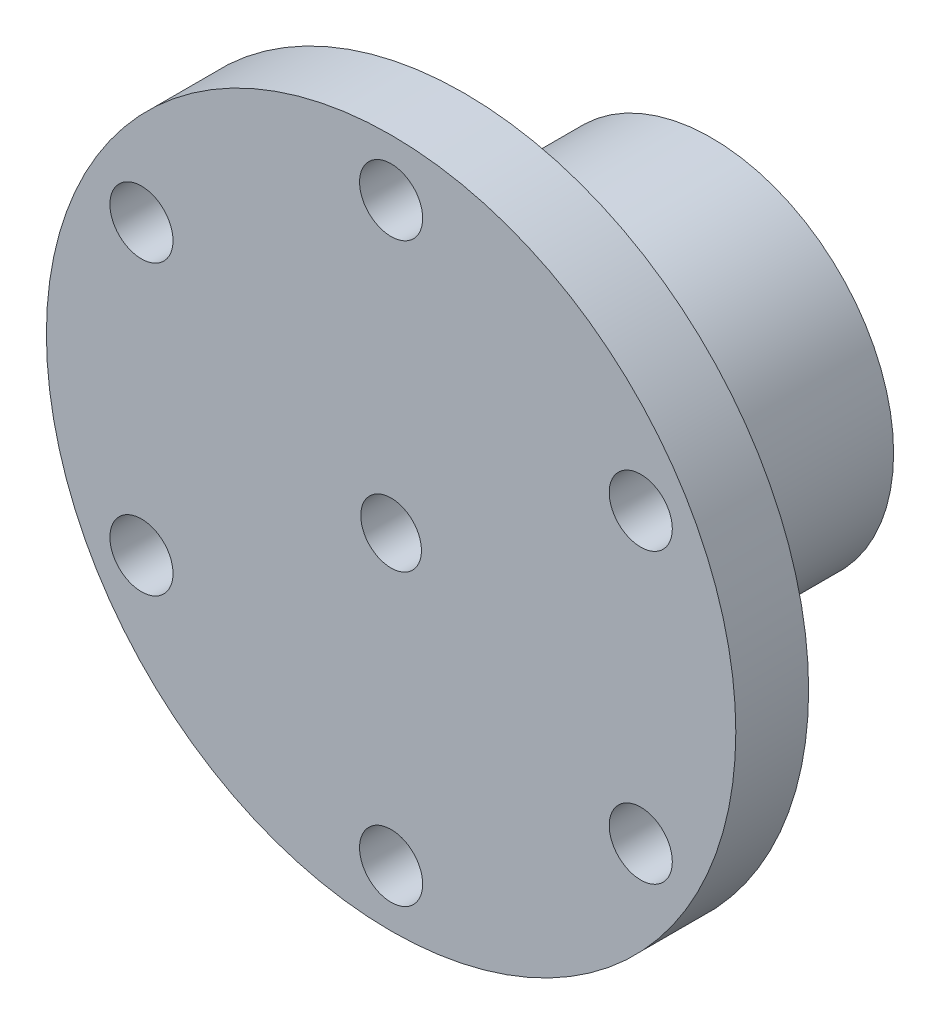
ISO-10303-21;
HEADER;
FILE_DESCRIPTION(('STEP AP214'),'2;1');
FILE_NAME('part.step','',(''),(''),'','','');
FILE_SCHEMA(('AUTOMOTIVE_DESIGN { 1 0 10303 214 1 1 1 1 }'));
ENDSEC;
DATA;
#1=APPLICATION_CONTEXT('core data for automotive mechanical design processes');
#2=APPLICATION_PROTOCOL_DEFINITION('international standard','automotive_design',2000,#1);
#3=PRODUCT_CONTEXT('',#1,'mechanical');
#4=PRODUCT('Part','Part','',(#3));
#5=PRODUCT_RELATED_PRODUCT_CATEGORY('part','',(#4));
#6=PRODUCT_DEFINITION_FORMATION('','',#4);
#7=PRODUCT_DEFINITION_CONTEXT('part definition',#1,'design');
#8=PRODUCT_DEFINITION('design','',#6,#7);
#9=PRODUCT_DEFINITION_SHAPE('','',#8);
#10=(LENGTH_UNIT() NAMED_UNIT(*) SI_UNIT(.MILLI.,.METRE.));
#11=(NAMED_UNIT(*) PLANE_ANGLE_UNIT() SI_UNIT($,.RADIAN.));
#12=(NAMED_UNIT(*) SI_UNIT($,.STERADIAN.) SOLID_ANGLE_UNIT());
#13=UNCERTAINTY_MEASURE_WITH_UNIT(LENGTH_MEASURE(1.E-05),#10,'distance_accuracy_value','');
#14=(GEOMETRIC_REPRESENTATION_CONTEXT(3) GLOBAL_UNCERTAINTY_ASSIGNED_CONTEXT((#13)) GLOBAL_UNIT_ASSIGNED_CONTEXT((#10,
#11,#12)) REPRESENTATION_CONTEXT('',''));
#15=CARTESIAN_POINT('',(0.,0.,0.));
#16=DIRECTION('',(0.,0.,1.));
#17=DIRECTION('',(1.,0.,0.));
#18=AXIS2_PLACEMENT_3D('',#15,#16,#17);
#19=CARTESIAN_POINT('',(28.4,0.,0.));
#20=DIRECTION('',(0.,0.,1.));
#21=DIRECTION('',(1.,0.,0.));
#22=AXIS2_PLACEMENT_3D('',#19,#20,#21);
#23=PLANE('',#22);
#24=CARTESIAN_POINT('',(0.,23.75,0.));
#25=DIRECTION('',(0.,0.,1.));
#26=DIRECTION('',(1.,0.,0.));
#27=AXIS2_PLACEMENT_3D('',#24,#25,#26);
#28=CIRCLE('',#27,2.6);
#29=CARTESIAN_POINT('',(2.59999999999998,23.75,0.));
#30=VERTEX_POINT('',#29);
#31=EDGE_CURVE('E191',#30,#30,#28,.T.);
#32=ORIENTED_EDGE('',*,*,#31,.F.);
#33=EDGE_LOOP('',(#32));
#34=FACE_BOUND('',#33,.T.);
#35=CARTESIAN_POINT('',(-20.5681033398801,11.8749999999994,0.));
#36=DIRECTION('',(0.,0.,1.));
#37=DIRECTION('',(1.,0.,0.));
#38=AXIS2_PLACEMENT_3D('',#35,#36,#37);
#39=CIRCLE('',#38,2.60000000000077);
#40=CARTESIAN_POINT('',(-17.9681033398793,11.8749999999994,0.));
#41=VERTEX_POINT('',#40);
#42=EDGE_CURVE('E211',#41,#41,#39,.T.);
#43=ORIENTED_EDGE('',*,*,#42,.F.);
#44=EDGE_LOOP('',(#43));
#45=FACE_BOUND('',#44,.T.);
#46=CARTESIAN_POINT('',(-20.5681033398794,-11.8750000000006,0.));
#47=DIRECTION('',(0.,0.,1.));
#48=DIRECTION('',(1.,0.,0.));
#49=AXIS2_PLACEMENT_3D('',#46,#47,#48);
#50=CIRCLE('',#49,2.60000000000135);
#51=CARTESIAN_POINT('',(-17.9681033398781,-11.8750000000006,0.));
#52=VERTEX_POINT('',#51);
#53=EDGE_CURVE('E215',#52,#52,#50,.T.);
#54=ORIENTED_EDGE('',*,*,#53,.F.);
#55=EDGE_LOOP('',(#54));
#56=FACE_BOUND('',#55,.T.);
#57=CARTESIAN_POINT('',(1.36012309829019E-12,-23.75,0.));
#58=DIRECTION('',(0.,0.,1.));
#59=DIRECTION('',(1.,0.,0.));
#60=AXIS2_PLACEMENT_3D('',#57,#58,#59);
#61=CIRCLE('',#60,2.60000000000144);
#62=CARTESIAN_POINT('',(2.6000000000028,-23.75,0.));
#63=VERTEX_POINT('',#62);
#64=EDGE_CURVE('E219',#63,#63,#61,.T.);
#65=ORIENTED_EDGE('',*,*,#64,.F.);
#66=EDGE_LOOP('',(#65));
#67=FACE_BOUND('',#66,.T.);
#68=CARTESIAN_POINT('',(20.5681033398814,-11.8749999999994,0.));
#69=DIRECTION('',(0.,0.,1.));
#70=DIRECTION('',(1.,0.,0.));
#71=AXIS2_PLACEMENT_3D('',#68,#69,#70);
#72=CIRCLE('',#71,2.6000000000009);
#73=CARTESIAN_POINT('',(23.1681033398823,-11.8749999999994,0.));
#74=VERTEX_POINT('',#73);
#75=EDGE_CURVE('E223',#74,#74,#72,.T.);
#76=ORIENTED_EDGE('',*,*,#75,.F.);
#77=EDGE_LOOP('',(#76));
#78=FACE_BOUND('',#77,.T.);
#79=CARTESIAN_POINT('',(20.5681033398807,11.8750000000006,0.));
#80=DIRECTION('',(0.,0.,1.));
#81=DIRECTION('',(1.,0.,0.));
#82=AXIS2_PLACEMENT_3D('',#79,#80,#81);
#83=CIRCLE('',#82,2.60000000000021);
#84=CARTESIAN_POINT('',(23.168103339881,11.8750000000006,0.));
#85=VERTEX_POINT('',#84);
#86=EDGE_CURVE('E195',#85,#85,#83,.T.);
#87=ORIENTED_EDGE('',*,*,#86,.F.);
#88=EDGE_LOOP('',(#87));
#89=FACE_BOUND('',#88,.T.);
#90=CARTESIAN_POINT('',(0.,0.,0.));
#91=DIRECTION('',(0.,0.,-1.));
#92=DIRECTION('',(-1.,0.,0.));
#93=AXIS2_PLACEMENT_3D('',#90,#91,#92);
#94=CIRCLE('',#93,2.5);
#95=CARTESIAN_POINT('',(-2.5,0.,0.));
#96=VERTEX_POINT('',#95);
#97=EDGE_CURVE('E114',#96,#96,#94,.T.);
#98=ORIENTED_EDGE('',*,*,#97,.T.);
#99=EDGE_LOOP('',(#98));
#100=FACE_BOUND('',#99,.T.);
#101=CARTESIAN_POINT('',(0.,0.,0.));
#102=DIRECTION('',(0.,0.,1.));
#103=DIRECTION('',(1.,0.,0.));
#104=AXIS2_PLACEMENT_3D('',#101,#102,#103);
#105=CIRCLE('',#104,28.4);
#106=CARTESIAN_POINT('',(28.4,0.,0.));
#107=VERTEX_POINT('',#106);
#108=EDGE_CURVE('E142',#107,#107,#105,.T.);
#109=ORIENTED_EDGE('',*,*,#108,.T.);
#110=EDGE_LOOP('',(#109));
#111=FACE_BOUND('',#110,.T.);
#112=ADVANCED_FACE('F41',(#34,#45,#56,#67,#78,#89,#100,#111),#23,.T.);
#113=CARTESIAN_POINT('',(0.,0.,-26.4));
#114=DIRECTION('',(0.,0.,-1.));
#115=DIRECTION('',(-1.,0.,0.));
#116=AXIS2_PLACEMENT_3D('',#113,#114,#115);
#117=PLANE('',#116);
#118=CARTESIAN_POINT('',(0.,0.,-26.4));
#119=DIRECTION('',(0.,0.,-1.));
#120=DIRECTION('',(-1.,0.,0.));
#121=AXIS2_PLACEMENT_3D('',#118,#119,#120);
#122=CIRCLE('',#121,2.5);
#123=CARTESIAN_POINT('',(-2.5,0.,-26.4));
#124=VERTEX_POINT('',#123);
#125=EDGE_CURVE('E112',#124,#124,#122,.T.);
#126=ORIENTED_EDGE('',*,*,#125,.F.);
#127=EDGE_LOOP('',(#126));
#128=FACE_BOUND('',#127,.T.);
#129=CARTESIAN_POINT('',(0.,0.,-26.4));
#130=DIRECTION('',(0.,0.,1.));
#131=DIRECTION('',(1.,0.,0.));
#132=AXIS2_PLACEMENT_3D('',#129,#130,#131);
#133=CIRCLE('',#132,15.);
#134=CARTESIAN_POINT('',(15.,0.,-26.4));
#135=VERTEX_POINT('',#134);
#136=EDGE_CURVE('E83',#135,#135,#133,.T.);
#137=ORIENTED_EDGE('',*,*,#136,.F.);
#138=EDGE_LOOP('',(#137));
#139=FACE_BOUND('',#138,.T.);
#140=ADVANCED_FACE('F121',(#128,#139),#117,.T.);
#141=CARTESIAN_POINT('',(0.,0.,0.));
#142=DIRECTION('',(0.,0.,1.));
#143=DIRECTION('',(1.,0.,0.));
#144=AXIS2_PLACEMENT_3D('',#141,#142,#143);
#145=CYLINDRICAL_SURFACE('',#144,15.);
#146=CARTESIAN_POINT('',(0.,-15.,-11.3702338694503));
#147=CARTESIAN_POINT('',(-0.1667307203779,-14.9999969274261,-11.3702400029453));
#148=CARTESIAN_POINT('',(-0.333538980604567,-14.9971915553469,-11.3841803983532));
#149=CARTESIAN_POINT('',(-0.662440523067058,-14.9862709686969,-11.439529369796));
#150=CARTESIAN_POINT('',(-0.824529952624068,-14.9781515358056,-11.4809597678548));
#151=CARTESIAN_POINT('',(-1.13919091578994,-14.9575094783486,-11.5899576903126));
#152=CARTESIAN_POINT('',(-1.2917714037994,-14.9449910723015,-11.6575001799843));
#153=CARTESIAN_POINT('',(-1.58342396659268,-14.9169119410594,-11.8167306119841));
#154=CARTESIAN_POINT('',(-1.72249684522744,-14.9013513970712,-11.9084171162719));
#155=CARTESIAN_POINT('',(-1.9850804319446,-14.8686649598991,-12.1146493523246));
#156=CARTESIAN_POINT('',(-2.10838185347557,-14.8515223651304,-12.2294589356239));
#157=CARTESIAN_POINT('',(-2.33411026982409,-14.8177254135776,-12.4781111186254));
#158=CARTESIAN_POINT('',(-2.43653563431127,-14.8010710950127,-12.6119552034556));
#159=CARTESIAN_POINT('',(-2.61849526004286,-14.7699732543785,-12.8963824484859));
#160=CARTESIAN_POINT('',(-2.6978128165976,-14.7555512209484,-13.0471068008393));
#161=CARTESIAN_POINT('',(-2.82991699974092,-14.7307880417525,-13.3600793264625));
#162=CARTESIAN_POINT('',(-2.88270624731171,-14.7204464928588,-13.5223263594893));
#163=CARTESIAN_POINT('',(-2.95957589965448,-14.7051841575661,-13.851486961174));
#164=CARTESIAN_POINT('',(-2.98402349387633,-14.7001941032156,-14.0183115018769));
#165=CARTESIAN_POINT('',(-3.00465638317836,-14.6959912518188,-14.3537633335433));
#166=CARTESIAN_POINT('',(-3.0008445681405,-14.6967778640352,-14.5223904384107));
#167=CARTESIAN_POINT('',(-2.96536371930546,-14.7039765344455,-14.8539742335133));
#168=CARTESIAN_POINT('',(-2.93411562073172,-14.7103035857629,-15.0169780863322));
#169=CARTESIAN_POINT('',(-2.84531365386915,-14.7277363848,-15.3353820994393));
#170=CARTESIAN_POINT('',(-2.78775852930204,-14.7388423607334,-15.4907818962073));
#171=CARTESIAN_POINT('',(-2.64757435102416,-14.7646685550122,-15.7907796545611));
#172=CARTESIAN_POINT('',(-2.56477845369634,-14.7794126944111,-15.9352975081578));
#173=CARTESIAN_POINT('',(-2.37658072371804,-14.8108385631919,-16.2085464193687));
#174=CARTESIAN_POINT('',(-2.27117629307049,-14.827520515151,-16.3372756600037));
#175=CARTESIAN_POINT('',(-2.03849980368175,-14.8613106372439,-16.5777220768211));
#176=CARTESIAN_POINT('',(-1.91086848363733,-14.8784210763271,-16.6890915730277));
#177=CARTESIAN_POINT('',(-1.63855507218603,-14.9108654614323,-16.8888954083539));
#178=CARTESIAN_POINT('',(-1.49387276213817,-14.9261993846692,-16.977329453331));
#179=CARTESIAN_POINT('',(-1.19117816063676,-14.9534007048266,-17.1288163971282));
#180=CARTESIAN_POINT('',(-1.0331454587559,-14.9652626654482,-17.1918295503839));
#181=CARTESIAN_POINT('',(-0.708446929345995,-14.9841422696357,-17.290315291566));
#182=CARTESIAN_POINT('',(-0.541782150217349,-14.9911605000159,-17.3257912156711));
#183=CARTESIAN_POINT('',(-0.207538216881452,-14.999480156006,-17.3677032308331));
#184=CARTESIAN_POINT('',(-0.040020984976729,-15.0008752395741,-17.3746151280711));
#185=CARTESIAN_POINT('',(0.293774802578142,-14.9980515579031,-17.3604842926237));
#186=CARTESIAN_POINT('',(0.460053427331379,-14.9938331082434,-17.3394431313925));
#187=CARTESIAN_POINT('',(0.785116979839622,-14.9803149602405,-17.2703987488184));
#188=CARTESIAN_POINT('',(0.943955845019709,-14.9710612921262,-17.2226396639566));
#189=CARTESIAN_POINT('',(1.251370882499,-14.948506561831,-17.1017819214828));
#190=CARTESIAN_POINT('',(1.39994628491262,-14.9352051964268,-17.0286813654198));
#191=CARTESIAN_POINT('',(1.68462352105865,-14.9057973459988,-16.8581863974963));
#192=CARTESIAN_POINT('',(1.82055038025656,-14.8896585131116,-16.7605055263334));
#193=CARTESIAN_POINT('',(2.07425405735762,-14.8564420448965,-16.5440062958284));
#194=CARTESIAN_POINT('',(2.19202892679229,-14.8393643090516,-16.4251856702507));
#195=CARTESIAN_POINT('',(2.40792177232253,-14.8058791067089,-16.1676138137769));
#196=CARTESIAN_POINT('',(2.50571310734597,-14.7894858069991,-16.0285866367863));
#197=CARTESIAN_POINT('',(2.67655626015362,-14.7595257538858,-15.7357997853802));
#198=CARTESIAN_POINT('',(2.74960906776871,-14.7459588874003,-15.5820407007296));
#199=CARTESIAN_POINT('',(2.86845552474588,-14.7233022175315,-15.2649291310016));
#200=CARTESIAN_POINT('',(2.91439049937315,-14.7141892461656,-15.1016313458193));
#201=CARTESIAN_POINT('',(2.97812595488159,-14.7014231037608,-14.7694335089775));
#202=CARTESIAN_POINT('',(2.99593010467534,-14.6977692207333,-14.6005341908222));
#203=CARTESIAN_POINT('',(3.00276273260241,-14.6963744889414,-14.2652072758173));
#204=CARTESIAN_POINT('',(2.99230736421269,-14.698527575679,-14.0987904226692));
#205=CARTESIAN_POINT('',(2.94405691230018,-14.7082672045384,-13.7701389197352));
#206=CARTESIAN_POINT('',(2.90626204838789,-14.7158537030151,-13.6079042363658));
#207=CARTESIAN_POINT('',(2.80463570549686,-14.7355579265748,-13.2925507357286));
#208=CARTESIAN_POINT('',(2.74086752015203,-14.7476646305649,-13.139410787943));
#209=CARTESIAN_POINT('',(2.58916393380481,-14.7750514492251,-12.8459227072469));
#210=CARTESIAN_POINT('',(2.50122650632465,-14.7903318299668,-12.7055756482748));
#211=CARTESIAN_POINT('',(2.30191774435924,-14.8226688156968,-12.4390871529993));
#212=CARTESIAN_POINT('',(2.19017366170554,-14.839751187291,-12.3132275736475));
#213=CARTESIAN_POINT('',(1.94719310703942,-14.8735824561586,-12.0818752528628));
#214=CARTESIAN_POINT('',(1.81595216146001,-14.8903312758955,-11.9763871984984));
#215=CARTESIAN_POINT('',(1.53605288726474,-14.9218149716391,-11.7877299376109));
#216=CARTESIAN_POINT('',(1.38722665328951,-14.9365269365774,-11.7048058596102));
#217=CARTESIAN_POINT('',(1.0774990828222,-14.96205375255,-11.5652755016605));
#218=CARTESIAN_POINT('',(0.916608782589378,-14.9728721141585,-11.5086455008528));
#219=CARTESIAN_POINT('',(0.629464466771337,-14.9872911778611,-11.4342780253161));
#220=CARTESIAN_POINT('',(0.504844992041353,-14.9920290947535,-11.410304288327));
#221=CARTESIAN_POINT('',(0.2534985756302,-14.9983846241968,-11.3782801323752));
#222=CARTESIAN_POINT('',(0.126771701245857,-15.0000023361946,-11.370229205921));
#223=CARTESIAN_POINT('',(0.,-15.,-11.3702338694503));
#224=B_SPLINE_CURVE_WITH_KNOTS('',3,(#146,#147,#148,#149,#150,#151,#152,#153,#154,#155,#156,
#157,#158,#159,#160,#161,#162,#163,#164,#165,#166,#167,#168,#169,#170,#171,#172,#173,#174,#175,
#176,#177,#178,#179,#180,#181,#182,#183,#184,#185,#186,#187,#188,#189,#190,#191,#192,#193,#194,
#195,#196,#197,#198,#199,#200,#201,#202,#203,#204,#205,#206,#207,#208,#209,#210,#211,#212,#213,
#214,#215,#216,#217,#218,#219,#220,#221,#222,#223),.UNSPECIFIED.,.T.,.F.,(4,2,2,2,2,2,2,2,2,2,2,
2,2,2,2,2,2,2,2,2,2,2,2,2,2,2,2,2,2,2,2,2,2,2,2,2,2,2,4),(0.,0.499728391983776,0.99985395207397,
1.49950120575103,1.99911870669259,2.50479801033656,3.0105167902421,3.52083585017768,
4.03110448095592,4.53468555310762,5.03821512843675,5.53415181018835,6.03011217761189,
6.52942470610778,7.02879464249011,7.53714757474052,8.04550702619461,8.55465824562072,
9.06374777094108,9.56432207028796,10.064868229736,10.5609136185217,11.0569961764807,
11.5591519810008,12.0613616503779,12.5712188573768,13.081055661704,13.5882114309817,
14.0953010499124,14.593191677031,15.0910783047783,15.5877588375933,16.084481027456,
16.5896422871743,17.0949196359879,17.6054849002691,18.1155886655256,18.4955632586968,
18.8755257411299),.UNSPECIFIED.);
#225=CARTESIAN_POINT('',(0.,-15.,-11.3702338694503));
#226=VERTEX_POINT('',#225);
#227=EDGE_CURVE('E78',#226,#226,#224,.T.);
#228=ORIENTED_EDGE('',*,*,#227,.F.);
#229=EDGE_LOOP('',(#228));
#230=FACE_BOUND('',#229,.T.);
#231=ORIENTED_EDGE('',*,*,#136,.T.);
#232=EDGE_LOOP('',(#231));
#233=FACE_BOUND('',#232,.T.);
#234=CARTESIAN_POINT('',(0.,0.,-6.));
#235=DIRECTION('',(0.,0.,1.));
#236=DIRECTION('',(1.,0.,0.));
#237=AXIS2_PLACEMENT_3D('',#234,#235,#236);
#238=CIRCLE('',#237,15.);
#239=CARTESIAN_POINT('',(15.,0.,-6.));
#240=VERTEX_POINT('',#239);
#241=EDGE_CURVE('E135',#240,#240,#238,.T.);
#242=ORIENTED_EDGE('',*,*,#241,.F.);
#243=EDGE_LOOP('',(#242));
#244=FACE_BOUND('',#243,.T.);
#245=ADVANCED_FACE('F116',(#230,#233,#244),#145,.T.);
#246=CARTESIAN_POINT('',(15.,0.,-6.));
#247=DIRECTION('',(0.,0.,-1.));
#248=DIRECTION('',(-1.,0.,0.));
#249=AXIS2_PLACEMENT_3D('',#246,#247,#248);
#250=PLANE('',#249);
#251=CARTESIAN_POINT('',(0.,23.75,-6.));
#252=DIRECTION('',(0.,0.,-1.));
#253=DIRECTION('',(-1.,0.,0.));
#254=AXIS2_PLACEMENT_3D('',#251,#252,#253);
#255=CIRCLE('',#254,2.6);
#256=CARTESIAN_POINT('',(-2.60000000000002,23.75,-6.));
#257=VERTEX_POINT('',#256);
#258=EDGE_CURVE('E44',#257,#257,#255,.T.);
#259=ORIENTED_EDGE('',*,*,#258,.F.);
#260=EDGE_LOOP('',(#259));
#261=FACE_BOUND('',#260,.T.);
#262=CARTESIAN_POINT('',(-20.5681033398801,11.8749999999994,-6.));
#263=DIRECTION('',(0.,0.,-1.));
#264=DIRECTION('',(-1.,0.,0.));
#265=AXIS2_PLACEMENT_3D('',#262,#263,#264);
#266=CIRCLE('',#265,2.60000000000077);
#267=CARTESIAN_POINT('',(-23.1681033398809,11.8749999999994,-6.));
#268=VERTEX_POINT('',#267);
#269=EDGE_CURVE('E171',#268,#268,#266,.T.);
#270=ORIENTED_EDGE('',*,*,#269,.F.);
#271=EDGE_LOOP('',(#270));
#272=FACE_BOUND('',#271,.T.);
#273=CARTESIAN_POINT('',(-20.5681033398794,-11.8750000000006,-6.));
#274=DIRECTION('',(0.,0.,-1.));
#275=DIRECTION('',(-1.,0.,0.));
#276=AXIS2_PLACEMENT_3D('',#273,#274,#275);
#277=CIRCLE('',#276,2.60000000000135);
#278=CARTESIAN_POINT('',(-23.1681033398807,-11.8750000000006,-6.));
#279=VERTEX_POINT('',#278);
#280=EDGE_CURVE('E175',#279,#279,#277,.T.);
#281=ORIENTED_EDGE('',*,*,#280,.F.);
#282=EDGE_LOOP('',(#281));
#283=FACE_BOUND('',#282,.T.);
#284=CARTESIAN_POINT('',(1.36012309829019E-12,-23.75,-6.));
#285=DIRECTION('',(0.,0.,-1.));
#286=DIRECTION('',(-1.,0.,0.));
#287=AXIS2_PLACEMENT_3D('',#284,#285,#286);
#288=CIRCLE('',#287,2.60000000000144);
#289=CARTESIAN_POINT('',(-2.60000000000008,-23.75,-6.));
#290=VERTEX_POINT('',#289);
#291=EDGE_CURVE('E179',#290,#290,#288,.T.);
#292=ORIENTED_EDGE('',*,*,#291,.F.);
#293=EDGE_LOOP('',(#292));
#294=FACE_BOUND('',#293,.T.);
#295=CARTESIAN_POINT('',(20.5681033398814,-11.8749999999994,-6.));
#296=DIRECTION('',(0.,0.,-1.));
#297=DIRECTION('',(-1.,0.,0.));
#298=AXIS2_PLACEMENT_3D('',#295,#296,#297);
#299=CIRCLE('',#298,2.6000000000009);
#300=CARTESIAN_POINT('',(17.9681033398805,-11.8749999999994,-6.));
#301=VERTEX_POINT('',#300);
#302=EDGE_CURVE('E183',#301,#301,#299,.T.);
#303=ORIENTED_EDGE('',*,*,#302,.F.);
#304=EDGE_LOOP('',(#303));
#305=FACE_BOUND('',#304,.T.);
#306=CARTESIAN_POINT('',(20.5681033398807,11.8750000000006,-6.));
#307=DIRECTION('',(0.,0.,-1.));
#308=DIRECTION('',(-1.,0.,0.));
#309=AXIS2_PLACEMENT_3D('',#306,#307,#308);
#310=CIRCLE('',#309,2.60000000000021);
#311=CARTESIAN_POINT('',(17.9681033398805,11.8750000000006,-6.));
#312=VERTEX_POINT('',#311);
#313=EDGE_CURVE('E187',#312,#312,#310,.T.);
#314=ORIENTED_EDGE('',*,*,#313,.F.);
#315=EDGE_LOOP('',(#314));
#316=FACE_BOUND('',#315,.T.);
#317=ORIENTED_EDGE('',*,*,#241,.T.);
#318=EDGE_LOOP('',(#317));
#319=FACE_BOUND('',#318,.T.);
#320=CARTESIAN_POINT('',(0.,0.,-6.));
#321=DIRECTION('',(0.,0.,1.));
#322=DIRECTION('',(1.,0.,0.));
#323=AXIS2_PLACEMENT_3D('',#320,#321,#322);
#324=CIRCLE('',#323,28.4);
#325=CARTESIAN_POINT('',(28.4,0.,-6.));
#326=VERTEX_POINT('',#325);
#327=EDGE_CURVE('E137',#326,#326,#324,.T.);
#328=ORIENTED_EDGE('',*,*,#327,.F.);
#329=EDGE_LOOP('',(#328));
#330=FACE_BOUND('',#329,.T.);
#331=ADVANCED_FACE('F120',(#261,#272,#283,#294,#305,#316,#319,#330),#250,.T.);
#332=CARTESIAN_POINT('',(0.,0.,0.));
#333=DIRECTION('',(0.,0.,1.));
#334=DIRECTION('',(1.,0.,0.));
#335=AXIS2_PLACEMENT_3D('',#332,#333,#334);
#336=CYLINDRICAL_SURFACE('',#335,28.4);
#337=ORIENTED_EDGE('',*,*,#327,.T.);
#338=EDGE_LOOP('',(#337));
#339=FACE_BOUND('',#338,.T.);
#340=ORIENTED_EDGE('',*,*,#108,.F.);
#341=EDGE_LOOP('',(#340));
#342=FACE_BOUND('',#341,.T.);
#343=ADVANCED_FACE('F150',(#339,#342),#336,.T.);
#344=CARTESIAN_POINT('',(0.,0.,0.));
#345=DIRECTION('',(0.,0.,-1.));
#346=DIRECTION('',(-1.,0.,0.));
#347=AXIS2_PLACEMENT_3D('',#344,#345,#346);
#348=CYLINDRICAL_SURFACE('',#347,2.5);
#349=CARTESIAN_POINT('',(-2.5,0.,-16.028546264628));
#350=CARTESIAN_POINT('',(-2.50001053689097,-0.0446676190961173,-16.0285141087577));
#351=CARTESIAN_POINT('',(-2.4988033626358,-0.089314675658222,-16.0303501467132));
#352=CARTESIAN_POINT('',(-2.49403945424107,-0.178118808574986,-16.0375070420826));
#353=CARTESIAN_POINT('',(-2.49048724961452,-0.222276662984988,-16.042821181246));
#354=CARTESIAN_POINT('',(-2.48118723003889,-0.309186552805187,-16.0565828523669));
#355=CARTESIAN_POINT('',(-2.47547237004126,-0.351949707497475,-16.0649833011456));
#356=CARTESIAN_POINT('',(-2.46196831278083,-0.436516845554949,-16.0845428881874));
#357=CARTESIAN_POINT('',(-2.4541779670438,-0.478320283905698,-16.0957035535761));
#358=CARTESIAN_POINT('',(-2.42094569151119,-0.634726425048235,-16.1424608128));
#359=CARTESIAN_POINT('',(-2.38888265367656,-0.745590990119838,-16.1860163358049));
#360=CARTESIAN_POINT('',(-2.31170305357439,-0.958667215286052,-16.2833244557639));
#361=CARTESIAN_POINT('',(-2.26647787223489,-1.06079733200858,-16.3371605663453));
#362=CARTESIAN_POINT('',(-2.17845139252837,-1.22908717969094,-16.4335719295434));
#363=CARTESIAN_POINT('',(-2.13847839662809,-1.2973472734266,-16.475111310331));
#364=CARTESIAN_POINT('',(-2.05253160808426,-1.42945216003762,-16.5590069911872));
#365=CARTESIAN_POINT('',(-2.00655528279991,-1.49329507193548,-16.6013636295708));
#366=CARTESIAN_POINT('',(-1.85992335660289,-1.67790046606017,-16.7276131401497));
#367=CARTESIAN_POINT('',(-1.75032166679402,-1.79220223726547,-16.8109677281389));
#368=CARTESIAN_POINT('',(-1.53332316028444,-1.9785848485795,-16.9513105059639));
#369=CARTESIAN_POINT('',(-1.43037180448632,-2.05448117836857,-17.0101447233153));
#370=CARTESIAN_POINT('',(-1.21029935284123,-2.19132333858639,-17.1179807673929));
#371=CARTESIAN_POINT('',(-1.09319843428571,-2.25229009148164,-17.1669963363295));
#372=CARTESIAN_POINT('',(-0.86792888330587,-2.3471135832324,-17.2439636851019));
#373=CARTESIAN_POINT('',(-0.761717046456599,-2.38383517864742,-17.2740921709753));
#374=CARTESIAN_POINT('',(-0.542830448073841,-2.44298114981978,-17.3228383119336));
#375=CARTESIAN_POINT('',(-0.430159668824183,-2.46541423403497,-17.3414629780731));
#376=CARTESIAN_POINT('',(-0.200906226670686,-2.49460149180071,-17.3657254677448));
#377=CARTESIAN_POINT('',(-0.084309197767468,-2.50128982658614,-17.3713087562689));
#378=CARTESIAN_POINT('',(0.148527340090238,-2.49829775944192,-17.3688153086557));
#379=CARTESIAN_POINT('',(0.26476685674393,-2.48861771252143,-17.3607388687802));
#380=CARTESIAN_POINT('',(0.485445759029516,-2.45478579221321,-17.3326472638875));
#381=CARTESIAN_POINT('',(0.590153469719589,-2.43164900062191,-17.3134699130215));
#382=CARTESIAN_POINT('',(0.793625750717628,-2.37305235039454,-17.2652471416044));
#383=CARTESIAN_POINT('',(0.892389435591344,-2.3375906611205,-17.2362002551288));
#384=CARTESIAN_POINT('',(1.09053416369652,-2.25240860554023,-17.1671367439191));
#385=CARTESIAN_POINT('',(1.18924473934221,-2.20172771983302,-17.1263940804671));
#386=CARTESIAN_POINT('',(1.3767800718126,-2.08960269254213,-17.0376810123086));
#387=CARTESIAN_POINT('',(1.46559592577916,-2.02814898391747,-16.9897041884889));
#388=CARTESIAN_POINT('',(1.67280362441446,-1.86454080960494,-16.8647218805297));
#389=CARTESIAN_POINT('',(1.78517382835748,-1.75692904106796,-16.7847619705372));
#390=CARTESIAN_POINT('',(1.9367015560364,-1.58276013263234,-16.6622735910188));
#391=CARTESIAN_POINT('',(1.98442714978063,-1.5224861962744,-16.6209603434809));
#392=CARTESIAN_POINT('',(2.07418686478911,-1.39772822879841,-16.5385177245863));
#393=CARTESIAN_POINT('',(2.11622304065682,-1.33324573004271,-16.4973882920655));
#394=CARTESIAN_POINT('',(2.21282190384309,-1.16889290959051,-16.3976005516117));
#395=CARTESIAN_POINT('',(2.26406445132992,-1.06656162182182,-16.3397280052798));
#396=CARTESIAN_POINT('',(2.35313154217164,-0.85216228093376,-16.2323844572273));
#397=CARTESIAN_POINT('',(2.39099119237605,-0.740120677710066,-16.1828916538639));
#398=CARTESIAN_POINT('',(2.44187928159532,-0.542368123492124,-16.1133590798508));
#399=CARTESIAN_POINT('',(2.45896760338397,-0.459278569532448,-16.0889456115926));
#400=CARTESIAN_POINT('',(2.48466533863309,-0.289382777852351,-16.0515946500309));
#401=CARTESIAN_POINT('',(2.49330657445815,-0.202591784872552,-16.0386141043883));
#402=CARTESIAN_POINT('',(2.49822814088172,-0.0960725270432474,-16.0312139859979));
#403=CARTESIAN_POINT('',(2.49889195042314,-0.0768814878014917,-16.0302152731885));
#404=CARTESIAN_POINT('',(2.49977745262101,-0.0384623376736702,-16.0288823370357));
#405=CARTESIAN_POINT('',(2.49999905762164,-0.0192342201937463,-16.0285482454366));
#406=CARTESIAN_POINT('',(2.5,0.,-16.028546264628));
#407=B_SPLINE_CURVE_WITH_KNOTS('',3,(#349,#350,#351,#352,#353,#354,#355,#356,#357,#358,#359,
#360,#361,#362,#363,#364,#365,#366,#367,#368,#369,#370,#371,#372,#373,#374,#375,#376,#377,#378,
#379,#380,#381,#382,#383,#384,#385,#386,#387,#388,#389,#390,#391,#392,#393,#394,#395,#396,#397,
#398,#399,#400,#401,#402,#403,#404,#405,#406),.UNSPECIFIED.,.F.,.F.,(4,2,2,2,2,2,2,2,2,2,2,2,2,
2,2,2,2,2,2,2,2,2,2,2,2,2,2,2,4),(0.,0.133915809511518,0.267573709534376,0.399271959248701,
0.531043236367036,0.898867426511475,1.26981755381915,1.53753000139769,1.8053557566704,
2.33924592067388,2.76010881123972,3.18037848070633,3.52797653415751,3.87536253284725,
4.22419861170398,4.57302712485181,4.89843954153485,5.22390031294721,5.57721326116425,
5.93084158108767,6.45264424433968,6.71427180911986,6.97580463953597,7.35949670871462,
7.74217465007992,8.00607441227289,8.26897611958204,8.32665105551863,8.38433742291033),.UNSPECIFIED.);
#408=CARTESIAN_POINT('',(-2.5,0.,-16.028546264628));
#409=VERTEX_POINT('',#408);
#410=CARTESIAN_POINT('',(2.5,0.,-16.028546264628));
#411=VERTEX_POINT('',#410);
#412=EDGE_CURVE('E74',#409,#411,#407,.T.);
#413=ORIENTED_EDGE('',*,*,#412,.T.);
#414=DIRECTION('',(0.,0.,-1.));
#415=VECTOR('',#414,1.);
#416=CARTESIAN_POINT('',(2.5,0.,0.));
#417=LINE('',#416,#415);
#418=CARTESIAN_POINT('',(2.5,0.,-12.7119214742726));
#419=VERTEX_POINT('',#418);
#420=EDGE_CURVE('E11',#411,#419,#417,.F.);
#421=ORIENTED_EDGE('',*,*,#420,.T.);
#422=CARTESIAN_POINT('',(2.5,0.,-12.7119214742726));
#423=CARTESIAN_POINT('',(2.50001053689097,-0.0446676190961172,-12.7119536301428));
#424=CARTESIAN_POINT('',(2.4988033626358,-0.0893146756582217,-12.7101175921874));
#425=CARTESIAN_POINT('',(2.49403945424107,-0.178118808574985,-12.7029606968179));
#426=CARTESIAN_POINT('',(2.49048724961452,-0.222276662984987,-12.6976465576546));
#427=CARTESIAN_POINT('',(2.48118723003889,-0.309186552805187,-12.6838848865336));
#428=CARTESIAN_POINT('',(2.47547237004126,-0.351949707497475,-12.6754844377549));
#429=CARTESIAN_POINT('',(2.46196831278083,-0.436516845554949,-12.6559248507131));
#430=CARTESIAN_POINT('',(2.4541779670438,-0.478320283905698,-12.6447641853244));
#431=CARTESIAN_POINT('',(2.42094569151119,-0.634726425048235,-12.5980069261005));
#432=CARTESIAN_POINT('',(2.38888265367656,-0.745590990119838,-12.5544514030956));
#433=CARTESIAN_POINT('',(2.31170305357439,-0.958667215286053,-12.4571432831366));
#434=CARTESIAN_POINT('',(2.26647787223489,-1.06079733200858,-12.4033071725553));
#435=CARTESIAN_POINT('',(2.17845139252837,-1.22908717969095,-12.3068958093571));
#436=CARTESIAN_POINT('',(2.13847839662809,-1.2973472734266,-12.2653564285695));
#437=CARTESIAN_POINT('',(2.05253160808425,-1.42945216003762,-12.1814607477133));
#438=CARTESIAN_POINT('',(2.00655528279991,-1.49329507193548,-12.1391041093297));
#439=CARTESIAN_POINT('',(1.85992335660289,-1.67790046606017,-12.0128545987509));
#440=CARTESIAN_POINT('',(1.75032166679402,-1.79220223726546,-11.9295000107617));
#441=CARTESIAN_POINT('',(1.53332316028444,-1.9785848485795,-11.7891572329367));
#442=CARTESIAN_POINT('',(1.43037180448632,-2.05448117836856,-11.7303230155852));
#443=CARTESIAN_POINT('',(1.21029935284124,-2.19132333858638,-11.6224869715076));
#444=CARTESIAN_POINT('',(1.09319843428571,-2.25229009148164,-11.573471402571));
#445=CARTESIAN_POINT('',(0.867928883305875,-2.3471135832324,-11.4965040537986));
#446=CARTESIAN_POINT('',(0.761717046456603,-2.38383517864742,-11.4663755679252));
#447=CARTESIAN_POINT('',(0.542830448073845,-2.44298114981978,-11.4176294269669));
#448=CARTESIAN_POINT('',(0.430159668824187,-2.46541423403497,-11.3990047608275));
#449=CARTESIAN_POINT('',(0.20090622667069,-2.49460149180071,-11.3747422711557));
#450=CARTESIAN_POINT('',(0.0843091977674718,-2.50128982658613,-11.3691589826316));
#451=CARTESIAN_POINT('',(-0.148527340090235,-2.49829775944192,-11.3716524302448));
#452=CARTESIAN_POINT('',(-0.264766856743926,-2.48861771252143,-11.3797288701203));
#453=CARTESIAN_POINT('',(-0.485445759029513,-2.45478579221322,-11.4078204750131));
#454=CARTESIAN_POINT('',(-0.590153469719586,-2.43164900062191,-11.426997825879));
#455=CARTESIAN_POINT('',(-0.793625750717624,-2.37305235039454,-11.4752205972961));
#456=CARTESIAN_POINT('',(-0.89238943559134,-2.3375906611205,-11.5042674837717));
#457=CARTESIAN_POINT('',(-1.09053416369652,-2.25240860554024,-11.5733309949814));
#458=CARTESIAN_POINT('',(-1.18924473934221,-2.20172771983302,-11.6140736584335));
#459=CARTESIAN_POINT('',(-1.3767800718126,-2.08960269254213,-11.7027867265919));
#460=CARTESIAN_POINT('',(-1.46559592577916,-2.02814898391747,-11.7507635504116));
#461=CARTESIAN_POINT('',(-1.67280362441445,-1.86454080960494,-11.8757458583709));
#462=CARTESIAN_POINT('',(-1.78517382835748,-1.75692904106797,-11.9557057683633));
#463=CARTESIAN_POINT('',(-1.93670155603639,-1.58276013263235,-12.0781941478817));
#464=CARTESIAN_POINT('',(-1.98442714978062,-1.5224861962744,-12.1195073954196));
#465=CARTESIAN_POINT('',(-2.07418686478911,-1.39772822879842,-12.2019500143142));
#466=CARTESIAN_POINT('',(-2.11622304065682,-1.33324573004271,-12.243079446835));
#467=CARTESIAN_POINT('',(-2.21282190384309,-1.16889290959051,-12.3428671872888));
#468=CARTESIAN_POINT('',(-2.26406445132992,-1.06656162182183,-12.4007397336207));
#469=CARTESIAN_POINT('',(-2.35313154217164,-0.852162280933765,-12.5080832816732));
#470=CARTESIAN_POINT('',(-2.39099119237604,-0.740120677710072,-12.5575760850366));
#471=CARTESIAN_POINT('',(-2.44187928159532,-0.542368123492128,-12.6271086590498));
#472=CARTESIAN_POINT('',(-2.45896760338397,-0.459278569532451,-12.6515221273079));
#473=CARTESIAN_POINT('',(-2.48466533863309,-0.289382777852354,-12.6888730888696));
#474=CARTESIAN_POINT('',(-2.49330657445815,-0.202591784872557,-12.7018536345122));
#475=CARTESIAN_POINT('',(-2.49822814088172,-0.0960725270432518,-12.7092537529027));
#476=CARTESIAN_POINT('',(-2.49889195042314,-0.0768814878014955,-12.710252465712));
#477=CARTESIAN_POINT('',(-2.49977745262101,-0.0384623376736723,-12.7115854018648));
#478=CARTESIAN_POINT('',(-2.49999905762164,-0.0192342201937473,-12.7119194934639));
#479=CARTESIAN_POINT('',(-2.5,0.,-12.7119214742726));
#480=B_SPLINE_CURVE_WITH_KNOTS('',3,(#422,#423,#424,#425,#426,#427,#428,#429,#430,#431,#432,
#433,#434,#435,#436,#437,#438,#439,#440,#441,#442,#443,#444,#445,#446,#447,#448,#449,#450,#451,
#452,#453,#454,#455,#456,#457,#458,#459,#460,#461,#462,#463,#464,#465,#466,#467,#468,#469,#470,
#471,#472,#473,#474,#475,#476,#477,#478,#479),.UNSPECIFIED.,.F.,.F.,(4,2,2,2,2,2,2,2,2,2,2,2,2,
2,2,2,2,2,2,2,2,2,2,2,2,2,2,2,4),(0.,0.133915809511517,0.267573709534376,0.399271959248702,
0.531043236367035,0.898867426511474,1.26981755381915,1.53753000139769,1.8053557566704,
2.33924592067388,2.76010881123972,3.18037848070633,3.5279765341575,3.87536253284724,
4.22419861170398,4.57302712485181,4.89843954153485,5.22390031294721,5.57721326116425,
5.93084158108767,6.45264424433968,6.71427180911986,6.97580463953597,7.35949670871461,
7.74217465007991,8.00607441227289,8.26897611958203,8.32665105551862,8.38433742291033),.UNSPECIFIED.);
#481=CARTESIAN_POINT('',(-2.5,0.,-12.7119214742726));
#482=VERTEX_POINT('',#481);
#483=EDGE_CURVE('E49',#419,#482,#480,.T.);
#484=ORIENTED_EDGE('',*,*,#483,.T.);
#485=DIRECTION('',(0.,0.,-1.));
#486=VECTOR('',#485,1.);
#487=CARTESIAN_POINT('',(-2.5,0.,0.));
#488=LINE('',#487,#486);
#489=EDGE_CURVE('E60',#482,#409,#488,.T.);
#490=ORIENTED_EDGE('',*,*,#489,.T.);
#491=EDGE_LOOP('',(#413,#421,#484,#490));
#492=FACE_BOUND('',#491,.T.);
#493=ORIENTED_EDGE('',*,*,#97,.F.);
#494=EDGE_LOOP('',(#493));
#495=FACE_BOUND('',#494,.T.);
#496=ORIENTED_EDGE('',*,*,#125,.T.);
#497=EDGE_LOOP('',(#496));
#498=FACE_BOUND('',#497,.T.);
#499=ADVANCED_FACE('F80',(#492,#495,#498),#348,.F.);
#500=CARTESIAN_POINT('',(0.,-28.4,-14.3702338694503));
#501=DIRECTION('',(0.,1.,0.));
#502=DIRECTION('',(0.,0.,1.));
#503=AXIS2_PLACEMENT_3D('',#500,#501,#502);
#504=CYLINDRICAL_SURFACE('',#503,3.);
#505=ORIENTED_EDGE('',*,*,#227,.T.);
#506=EDGE_LOOP('',(#505));
#507=FACE_BOUND('',#506,.T.);
#508=CARTESIAN_POINT('',(0.,0.,-14.3702338694503));
#509=DIRECTION('',(0.,1.,0.));
#510=DIRECTION('',(0.,0.,1.));
#511=AXIS2_PLACEMENT_3D('',#508,#509,#510);
#512=CIRCLE('',#511,3.);
#513=EDGE_CURVE('E71',#419,#411,#512,.T.);
#514=ORIENTED_EDGE('',*,*,#513,.T.);
#515=ORIENTED_EDGE('',*,*,#412,.F.);
#516=EDGE_CURVE('E56',#409,#482,#512,.T.);
#517=ORIENTED_EDGE('',*,*,#516,.T.);
#518=ORIENTED_EDGE('',*,*,#483,.F.);
#519=EDGE_LOOP('',(#514,#515,#517,#518));
#520=FACE_BOUND('',#519,.T.);
#521=ADVANCED_FACE('F70',(#507,#520),#504,.F.);
#522=CARTESIAN_POINT('',(0.,0.,-14.3702338694503));
#523=DIRECTION('',(0.,1.,0.));
#524=DIRECTION('',(0.,0.,1.));
#525=AXIS2_PLACEMENT_3D('',#522,#523,#524);
#526=PLANE('',#525);
#527=ORIENTED_EDGE('',*,*,#513,.F.);
#528=ORIENTED_EDGE('',*,*,#420,.F.);
#529=EDGE_LOOP('',(#527,#528));
#530=FACE_BOUND('',#529,.T.);
#531=ADVANCED_FACE('F77',(#530),#526,.F.);
#532=ORIENTED_EDGE('',*,*,#516,.F.);
#533=ORIENTED_EDGE('',*,*,#489,.F.);
#534=EDGE_LOOP('',(#532,#533));
#535=FACE_BOUND('',#534,.T.);
#536=ADVANCED_FACE('F246',(#535),#526,.F.);
#537=CARTESIAN_POINT('',(20.5681033398807,11.8750000000006,-26.4));
#538=DIRECTION('',(0.,0.,1.));
#539=DIRECTION('',(1.,0.,0.));
#540=AXIS2_PLACEMENT_3D('',#537,#538,#539);
#541=CYLINDRICAL_SURFACE('',#540,2.60000000000021);
#542=ORIENTED_EDGE('',*,*,#313,.T.);
#543=EDGE_LOOP('',(#542));
#544=FACE_BOUND('',#543,.T.);
#545=ORIENTED_EDGE('',*,*,#86,.T.);
#546=EDGE_LOOP('',(#545));
#547=FACE_BOUND('',#546,.T.);
#548=ADVANCED_FACE('F242',(#544,#547),#541,.F.);
#549=CARTESIAN_POINT('',(20.5681033398814,-11.8749999999994,-26.4));
#550=DIRECTION('',(0.,0.,1.));
#551=DIRECTION('',(1.,0.,0.));
#552=AXIS2_PLACEMENT_3D('',#549,#550,#551);
#553=CYLINDRICAL_SURFACE('',#552,2.6000000000009);
#554=ORIENTED_EDGE('',*,*,#302,.T.);
#555=EDGE_LOOP('',(#554));
#556=FACE_BOUND('',#555,.T.);
#557=ORIENTED_EDGE('',*,*,#75,.T.);
#558=EDGE_LOOP('',(#557));
#559=FACE_BOUND('',#558,.T.);
#560=ADVANCED_FACE('F245',(#556,#559),#553,.F.);
#561=CARTESIAN_POINT('',(1.36012309829019E-12,-23.75,-26.4));
#562=DIRECTION('',(0.,0.,1.));
#563=DIRECTION('',(1.,0.,0.));
#564=AXIS2_PLACEMENT_3D('',#561,#562,#563);
#565=CYLINDRICAL_SURFACE('',#564,2.60000000000144);
#566=ORIENTED_EDGE('',*,*,#291,.T.);
#567=EDGE_LOOP('',(#566));
#568=FACE_BOUND('',#567,.T.);
#569=ORIENTED_EDGE('',*,*,#64,.T.);
#570=EDGE_LOOP('',(#569));
#571=FACE_BOUND('',#570,.T.);
#572=ADVANCED_FACE('F239',(#568,#571),#565,.F.);
#573=CARTESIAN_POINT('',(-20.5681033398794,-11.8750000000006,-26.4));
#574=DIRECTION('',(0.,0.,1.));
#575=DIRECTION('',(1.,0.,0.));
#576=AXIS2_PLACEMENT_3D('',#573,#574,#575);
#577=CYLINDRICAL_SURFACE('',#576,2.60000000000135);
#578=ORIENTED_EDGE('',*,*,#280,.T.);
#579=EDGE_LOOP('',(#578));
#580=FACE_BOUND('',#579,.T.);
#581=ORIENTED_EDGE('',*,*,#53,.T.);
#582=EDGE_LOOP('',(#581));
#583=FACE_BOUND('',#582,.T.);
#584=ADVANCED_FACE('F234',(#580,#583),#577,.F.);
#585=CARTESIAN_POINT('',(-20.5681033398801,11.8749999999994,-26.4));
#586=DIRECTION('',(0.,0.,1.));
#587=DIRECTION('',(1.,0.,0.));
#588=AXIS2_PLACEMENT_3D('',#585,#586,#587);
#589=CYLINDRICAL_SURFACE('',#588,2.60000000000077);
#590=ORIENTED_EDGE('',*,*,#269,.T.);
#591=EDGE_LOOP('',(#590));
#592=FACE_BOUND('',#591,.T.);
#593=ORIENTED_EDGE('',*,*,#42,.T.);
#594=EDGE_LOOP('',(#593));
#595=FACE_BOUND('',#594,.T.);
#596=ADVANCED_FACE('F204',(#592,#595),#589,.F.);
#597=CARTESIAN_POINT('',(0.,23.75,-26.4));
#598=DIRECTION('',(0.,0.,1.));
#599=DIRECTION('',(1.,0.,0.));
#600=AXIS2_PLACEMENT_3D('',#597,#598,#599);
#601=CYLINDRICAL_SURFACE('',#600,2.6);
#602=ORIENTED_EDGE('',*,*,#258,.T.);
#603=EDGE_LOOP('',(#602));
#604=FACE_BOUND('',#603,.T.);
#605=ORIENTED_EDGE('',*,*,#31,.T.);
#606=EDGE_LOOP('',(#605));
#607=FACE_BOUND('',#606,.T.);
#608=ADVANCED_FACE('F201',(#604,#607),#601,.F.);
#609=CLOSED_SHELL('',(#112,#140,#245,#331,#343,#499,#521,#531,#536,#548,#560,#572,#584,#596,#608));
#610=MANIFOLD_SOLID_BREP('B2',#609);
#611=ADVANCED_BREP_SHAPE_REPRESENTATION('',(#18,#610),#14);
#612=SHAPE_DEFINITION_REPRESENTATION(#9,#611);
ENDSEC;
END-ISO-10303-21;
